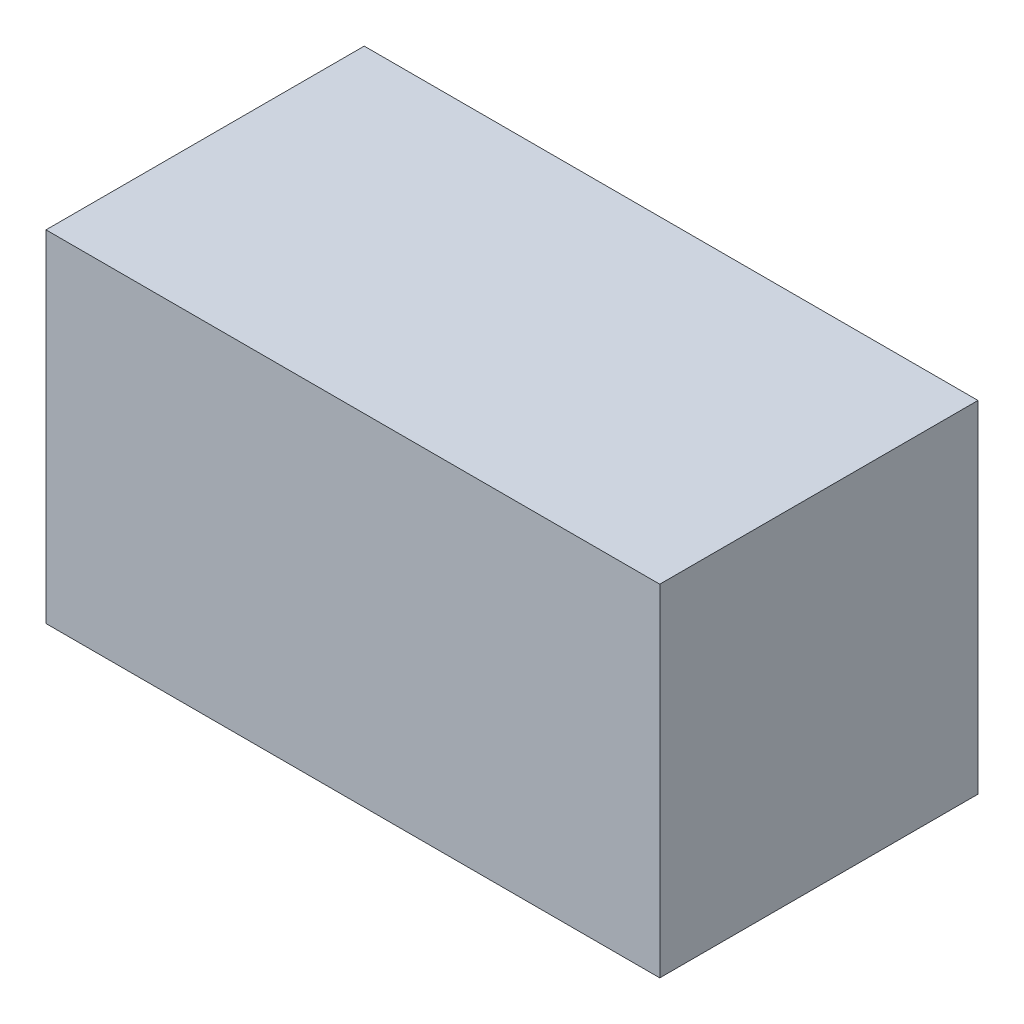
ISO-10303-21;
HEADER;
FILE_DESCRIPTION(('STEP AP214'),'2;1');
FILE_NAME('part.step','',(''),(''),'','','');
FILE_SCHEMA(('AUTOMOTIVE_DESIGN { 1 0 10303 214 1 1 1 1 }'));
ENDSEC;
DATA;
#1=APPLICATION_CONTEXT('core data for automotive mechanical design processes');
#2=APPLICATION_PROTOCOL_DEFINITION('international standard','automotive_design',2000,#1);
#3=PRODUCT_CONTEXT('',#1,'mechanical');
#4=PRODUCT('Part','Part','',(#3));
#5=PRODUCT_RELATED_PRODUCT_CATEGORY('part','',(#4));
#6=PRODUCT_DEFINITION_FORMATION('','',#4);
#7=PRODUCT_DEFINITION_CONTEXT('part definition',#1,'design');
#8=PRODUCT_DEFINITION('design','',#6,#7);
#9=PRODUCT_DEFINITION_SHAPE('','',#8);
#10=(LENGTH_UNIT() NAMED_UNIT(*) SI_UNIT(.MILLI.,.METRE.));
#11=(NAMED_UNIT(*) PLANE_ANGLE_UNIT() SI_UNIT($,.RADIAN.));
#12=(NAMED_UNIT(*) SI_UNIT($,.STERADIAN.) SOLID_ANGLE_UNIT());
#13=UNCERTAINTY_MEASURE_WITH_UNIT(LENGTH_MEASURE(1.E-05),#10,'distance_accuracy_value','');
#14=(GEOMETRIC_REPRESENTATION_CONTEXT(3) GLOBAL_UNCERTAINTY_ASSIGNED_CONTEXT((#13)) GLOBAL_UNIT_ASSIGNED_CONTEXT((#10,
#11,#12)) REPRESENTATION_CONTEXT('',''));
#15=CARTESIAN_POINT('',(0.,0.,0.));
#16=DIRECTION('',(0.,0.,1.));
#17=DIRECTION('',(1.,0.,0.));
#18=AXIS2_PLACEMENT_3D('',#15,#16,#17);
#19=CARTESIAN_POINT('',(0.,750.,0.));
#20=DIRECTION('',(1.,0.,0.));
#21=DIRECTION('',(0.,0.,-1.));
#22=AXIS2_PLACEMENT_3D('',#19,#20,#21);
#23=PLANE('',#22);
#24=DIRECTION('',(0.,0.,1.));
#25=VECTOR('',#24,1.);
#26=CARTESIAN_POINT('',(0.,0.,0.));
#27=LINE('',#26,#25);
#28=CARTESIAN_POINT('',(0.,0.,-700.));
#29=VERTEX_POINT('',#28);
#30=CARTESIAN_POINT('',(0.,0.,0.));
#31=VERTEX_POINT('',#30);
#32=EDGE_CURVE('E114',#29,#31,#27,.T.);
#33=ORIENTED_EDGE('',*,*,#32,.T.);
#34=DIRECTION('',(0.,-1.,0.));
#35=VECTOR('',#34,1.);
#36=CARTESIAN_POINT('',(0.,750.,0.));
#37=LINE('',#36,#35);
#38=CARTESIAN_POINT('',(0.,750.,0.));
#39=VERTEX_POINT('',#38);
#40=EDGE_CURVE('E11',#39,#31,#37,.T.);
#41=ORIENTED_EDGE('',*,*,#40,.F.);
#42=DIRECTION('',(0.,0.,1.));
#43=VECTOR('',#42,1.);
#44=CARTESIAN_POINT('',(0.,750.,0.));
#45=LINE('',#44,#43);
#46=CARTESIAN_POINT('',(0.,750.,-700.));
#47=VERTEX_POINT('',#46);
#48=EDGE_CURVE('E100',#47,#39,#45,.T.);
#49=ORIENTED_EDGE('',*,*,#48,.F.);
#50=DIRECTION('',(0.,-1.,0.));
#51=VECTOR('',#50,1.);
#52=CARTESIAN_POINT('',(0.,750.,-700.));
#53=LINE('',#52,#51);
#54=EDGE_CURVE('E108',#47,#29,#53,.T.);
#55=ORIENTED_EDGE('',*,*,#54,.T.);
#56=EDGE_LOOP('',(#33,#41,#49,#55));
#57=FACE_BOUND('',#56,.T.);
#58=ADVANCED_FACE('F44',(#57),#23,.F.);
#59=CARTESIAN_POINT('',(0.,750.,0.));
#60=DIRECTION('',(0.,0.,-1.));
#61=DIRECTION('',(-1.,0.,0.));
#62=AXIS2_PLACEMENT_3D('',#59,#60,#61);
#63=PLANE('',#62);
#64=DIRECTION('',(1.,0.,0.));
#65=VECTOR('',#64,1.);
#66=CARTESIAN_POINT('',(0.,0.,0.));
#67=LINE('',#66,#65);
#68=CARTESIAN_POINT('',(1350.,0.,0.));
#69=VERTEX_POINT('',#68);
#70=EDGE_CURVE('E105',#31,#69,#67,.T.);
#71=ORIENTED_EDGE('',*,*,#70,.T.);
#72=DIRECTION('',(0.,-1.,0.));
#73=VECTOR('',#72,1.);
#74=CARTESIAN_POINT('',(1350.,750.,0.));
#75=LINE('',#74,#73);
#76=CARTESIAN_POINT('',(1350.,750.,0.));
#77=VERTEX_POINT('',#76);
#78=EDGE_CURVE('E53',#77,#69,#75,.T.);
#79=ORIENTED_EDGE('',*,*,#78,.F.);
#80=DIRECTION('',(1.,0.,0.));
#81=VECTOR('',#80,1.);
#82=CARTESIAN_POINT('',(0.,750.,0.));
#83=LINE('',#82,#81);
#84=EDGE_CURVE('E95',#39,#77,#83,.T.);
#85=ORIENTED_EDGE('',*,*,#84,.F.);
#86=ORIENTED_EDGE('',*,*,#40,.T.);
#87=EDGE_LOOP('',(#71,#79,#85,#86));
#88=FACE_BOUND('',#87,.T.);
#89=ADVANCED_FACE('F101',(#88),#63,.F.);
#90=CARTESIAN_POINT('',(1350.,750.,0.));
#91=DIRECTION('',(-1.,0.,0.));
#92=DIRECTION('',(0.,0.,1.));
#93=AXIS2_PLACEMENT_3D('',#90,#91,#92);
#94=PLANE('',#93);
#95=DIRECTION('',(0.,0.,-1.));
#96=VECTOR('',#95,1.);
#97=CARTESIAN_POINT('',(1350.,0.,0.));
#98=LINE('',#97,#96);
#99=CARTESIAN_POINT('',(1350.,0.,-700.));
#100=VERTEX_POINT('',#99);
#101=EDGE_CURVE('E78',#69,#100,#98,.T.);
#102=ORIENTED_EDGE('',*,*,#101,.T.);
#103=DIRECTION('',(0.,-1.,0.));
#104=VECTOR('',#103,1.);
#105=CARTESIAN_POINT('',(1350.,750.,-700.));
#106=LINE('',#105,#104);
#107=CARTESIAN_POINT('',(1350.,750.,-700.));
#108=VERTEX_POINT('',#107);
#109=EDGE_CURVE('E102',#108,#100,#106,.T.);
#110=ORIENTED_EDGE('',*,*,#109,.F.);
#111=DIRECTION('',(0.,0.,-1.));
#112=VECTOR('',#111,1.);
#113=CARTESIAN_POINT('',(1350.,750.,0.));
#114=LINE('',#113,#112);
#115=EDGE_CURVE('E92',#77,#108,#114,.T.);
#116=ORIENTED_EDGE('',*,*,#115,.F.);
#117=ORIENTED_EDGE('',*,*,#78,.T.);
#118=EDGE_LOOP('',(#102,#110,#116,#117));
#119=FACE_BOUND('',#118,.T.);
#120=ADVANCED_FACE('F104',(#119),#94,.F.);
#121=CARTESIAN_POINT('',(0.,750.,-700.));
#122=DIRECTION('',(0.,0.,1.));
#123=DIRECTION('',(1.,0.,0.));
#124=AXIS2_PLACEMENT_3D('',#121,#122,#123);
#125=PLANE('',#124);
#126=DIRECTION('',(-1.,0.,0.));
#127=VECTOR('',#126,1.);
#128=CARTESIAN_POINT('',(0.,0.,-700.));
#129=LINE('',#128,#127);
#130=EDGE_CURVE('E82',#100,#29,#129,.T.);
#131=ORIENTED_EDGE('',*,*,#130,.T.);
#132=ORIENTED_EDGE('',*,*,#54,.F.);
#133=DIRECTION('',(-1.,0.,0.));
#134=VECTOR('',#133,1.);
#135=CARTESIAN_POINT('',(0.,750.,-700.));
#136=LINE('',#135,#134);
#137=EDGE_CURVE('E61',#108,#47,#136,.T.);
#138=ORIENTED_EDGE('',*,*,#137,.F.);
#139=ORIENTED_EDGE('',*,*,#109,.T.);
#140=EDGE_LOOP('',(#131,#132,#138,#139));
#141=FACE_BOUND('',#140,.T.);
#142=ADVANCED_FACE('F127',(#141),#125,.F.);
#143=CARTESIAN_POINT('',(0.,750.,0.));
#144=DIRECTION('',(0.,-1.,0.));
#145=DIRECTION('',(0.,0.,-1.));
#146=AXIS2_PLACEMENT_3D('',#143,#144,#145);
#147=PLANE('',#146);
#148=ORIENTED_EDGE('',*,*,#48,.T.);
#149=ORIENTED_EDGE('',*,*,#84,.T.);
#150=ORIENTED_EDGE('',*,*,#115,.T.);
#151=ORIENTED_EDGE('',*,*,#137,.T.);
#152=EDGE_LOOP('',(#148,#149,#150,#151));
#153=FACE_BOUND('',#152,.T.);
#154=ADVANCED_FACE('F91',(#153),#147,.F.);
#155=CARTESIAN_POINT('',(0.,0.,0.));
#156=DIRECTION('',(0.,-1.,0.));
#157=DIRECTION('',(0.,0.,-1.));
#158=AXIS2_PLACEMENT_3D('',#155,#156,#157);
#159=PLANE('',#158);
#160=ORIENTED_EDGE('',*,*,#32,.F.);
#161=ORIENTED_EDGE('',*,*,#130,.F.);
#162=ORIENTED_EDGE('',*,*,#101,.F.);
#163=ORIENTED_EDGE('',*,*,#70,.F.);
#164=EDGE_LOOP('',(#160,#161,#162,#163));
#165=FACE_BOUND('',#164,.T.);
#166=ADVANCED_FACE('F129',(#165),#159,.T.);
#167=CLOSED_SHELL('',(#58,#89,#120,#142,#154,#166));
#168=MANIFOLD_SOLID_BREP('B2',#167);
#169=ADVANCED_BREP_SHAPE_REPRESENTATION('',(#18,#168),#14);
#170=SHAPE_DEFINITION_REPRESENTATION(#9,#169);
ENDSEC;
END-ISO-10303-21;
